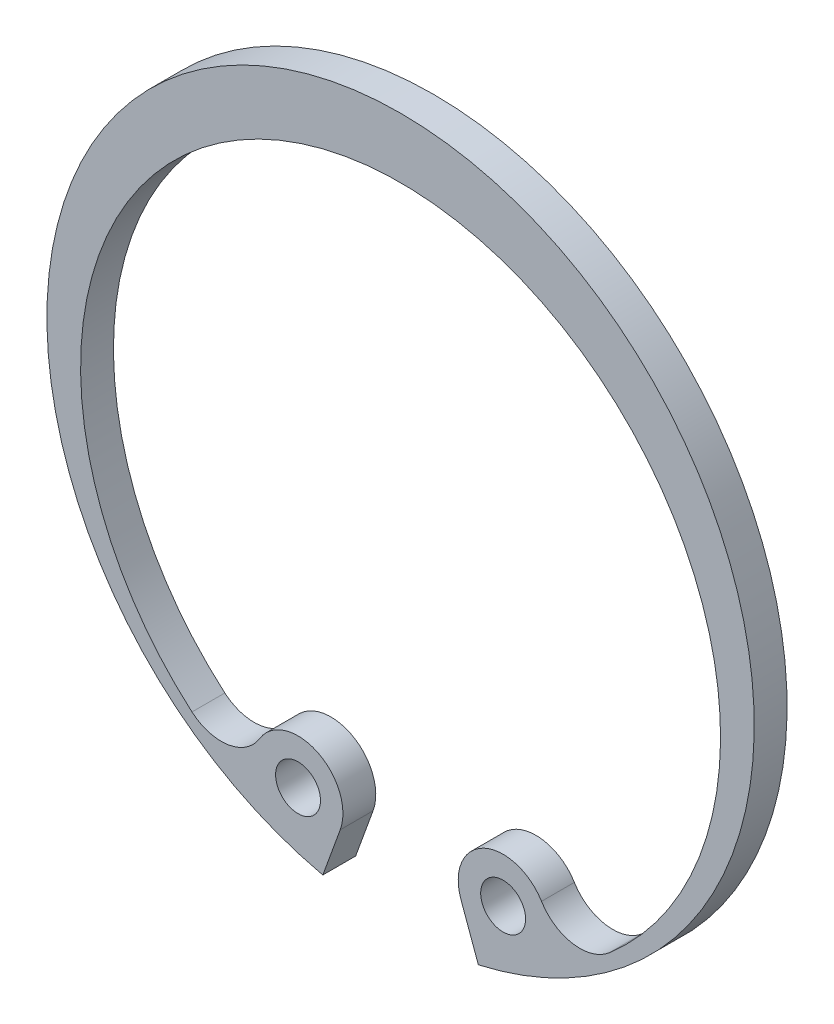
ISO-10303-21;
HEADER;
FILE_DESCRIPTION(('STEP AP214'),'2;1');
FILE_NAME('part.step','',(''),(''),'','','');
FILE_SCHEMA(('AUTOMOTIVE_DESIGN { 1 0 10303 214 1 1 1 1 }'));
ENDSEC;
DATA;
#1=APPLICATION_CONTEXT('core data for automotive mechanical design processes');
#2=APPLICATION_PROTOCOL_DEFINITION('international standard','automotive_design',2000,#1);
#3=PRODUCT_CONTEXT('',#1,'mechanical');
#4=PRODUCT('Part','Part','',(#3));
#5=PRODUCT_RELATED_PRODUCT_CATEGORY('part','',(#4));
#6=PRODUCT_DEFINITION_FORMATION('','',#4);
#7=PRODUCT_DEFINITION_CONTEXT('part definition',#1,'design');
#8=PRODUCT_DEFINITION('design','',#6,#7);
#9=PRODUCT_DEFINITION_SHAPE('','',#8);
#10=(LENGTH_UNIT() NAMED_UNIT(*) SI_UNIT(.MILLI.,.METRE.));
#11=(NAMED_UNIT(*) PLANE_ANGLE_UNIT() SI_UNIT($,.RADIAN.));
#12=(NAMED_UNIT(*) SI_UNIT($,.STERADIAN.) SOLID_ANGLE_UNIT());
#13=UNCERTAINTY_MEASURE_WITH_UNIT(LENGTH_MEASURE(1.E-05),#10,'distance_accuracy_value','');
#14=(GEOMETRIC_REPRESENTATION_CONTEXT(3) GLOBAL_UNCERTAINTY_ASSIGNED_CONTEXT((#13)) GLOBAL_UNIT_ASSIGNED_CONTEXT((#10,
#11,#12)) REPRESENTATION_CONTEXT('',''));
#15=CARTESIAN_POINT('',(0.,0.,0.));
#16=DIRECTION('',(0.,0.,1.));
#17=DIRECTION('',(1.,0.,0.));
#18=AXIS2_PLACEMENT_3D('',#15,#16,#17);
#19=CARTESIAN_POINT('',(0.,-0.7874,1.95));
#20=DIRECTION('',(0.,0.,-1.));
#21=DIRECTION('',(-1.,0.,0.));
#22=AXIS2_PLACEMENT_3D('',#19,#20,#21);
#23=CYLINDRICAL_SURFACE('',#22,9.5);
#24=CARTESIAN_POINT('',(0.,-0.7874,0.975));
#25=DIRECTION('',(0.,0.,1.));
#26=DIRECTION('',(1.,0.,0.));
#27=AXIS2_PLACEMENT_3D('',#24,#25,#26);
#28=CIRCLE('',#27,9.5);
#29=CARTESIAN_POINT('',(6.19276009205528,-7.99154619800622,0.975));
#30=VERTEX_POINT('',#29);
#31=CARTESIAN_POINT('',(-6.19276009205528,-7.99154619800622,0.975));
#32=VERTEX_POINT('',#31);
#33=EDGE_CURVE('E132',#30,#32,#28,.T.);
#34=ORIENTED_EDGE('',*,*,#33,.F.);
#35=DIRECTION('',(0.,0.,-1.));
#36=VECTOR('',#35,1.);
#37=CARTESIAN_POINT('',(6.19276009205528,-7.99154619800622,1.95));
#38=LINE('',#37,#36);
#39=CARTESIAN_POINT('',(6.19276009205528,-7.99154619800622,1.95));
#40=VERTEX_POINT('',#39);
#41=EDGE_CURVE('E11',#40,#30,#38,.T.);
#42=ORIENTED_EDGE('',*,*,#41,.F.);
#43=CARTESIAN_POINT('',(0.,-0.7874,1.95));
#44=DIRECTION('',(0.,0.,1.));
#45=DIRECTION('',(1.,0.,0.));
#46=AXIS2_PLACEMENT_3D('',#43,#44,#45);
#47=CIRCLE('',#46,9.5);
#48=CARTESIAN_POINT('',(-6.19276009205528,-7.99154619800622,1.95));
#49=VERTEX_POINT('',#48);
#50=EDGE_CURVE('E153',#40,#49,#47,.T.);
#51=ORIENTED_EDGE('',*,*,#50,.T.);
#52=DIRECTION('',(0.,0.,-1.));
#53=VECTOR('',#52,1.);
#54=CARTESIAN_POINT('',(-6.19276009205528,-7.99154619800622,1.95));
#55=LINE('',#54,#53);
#56=EDGE_CURVE('E38',#49,#32,#55,.T.);
#57=ORIENTED_EDGE('',*,*,#56,.T.);
#58=EDGE_LOOP('',(#34,#42,#51,#57));
#59=FACE_BOUND('',#58,.T.);
#60=ADVANCED_FACE('F35',(#59),#23,.F.);
#61=CARTESIAN_POINT('',(5.32360078088962,-6.98043795968956,1.95));
#62=DIRECTION('',(0.,0.,-1.));
#63=DIRECTION('',(-1.,0.,0.));
#64=AXIS2_PLACEMENT_3D('',#61,#62,#63);
#65=CYLINDRICAL_SURFACE('',#64,1.33333333333333);
#66=CARTESIAN_POINT('',(5.32360078088962,-6.98043795968956,0.975));
#67=DIRECTION('',(0.,0.,1.));
#68=DIRECTION('',(1.,0.,0.));
#69=AXIS2_PLACEMENT_3D('',#66,#67,#68);
#70=CIRCLE('',#69,1.33333333333333);
#71=CARTESIAN_POINT('',(4.18415582842588,-7.67285617008172,0.975));
#72=VERTEX_POINT('',#71);
#73=EDGE_CURVE('E151',#72,#30,#70,.T.);
#74=ORIENTED_EDGE('',*,*,#73,.F.);
#75=DIRECTION('',(0.,0.,-1.));
#76=VECTOR('',#75,1.);
#77=CARTESIAN_POINT('',(4.18415582842588,-7.67285617008172,1.95));
#78=LINE('',#77,#76);
#79=CARTESIAN_POINT('',(4.18415582842588,-7.67285617008172,1.95));
#80=VERTEX_POINT('',#79);
#81=EDGE_CURVE('E44',#80,#72,#78,.T.);
#82=ORIENTED_EDGE('',*,*,#81,.F.);
#83=CARTESIAN_POINT('',(5.32360078088962,-6.98043795968956,1.95));
#84=DIRECTION('',(0.,0.,1.));
#85=DIRECTION('',(1.,0.,0.));
#86=AXIS2_PLACEMENT_3D('',#83,#84,#85);
#87=CIRCLE('',#86,1.33333333333333);
#88=EDGE_CURVE('E122',#80,#40,#87,.T.);
#89=ORIENTED_EDGE('',*,*,#88,.T.);
#90=ORIENTED_EDGE('',*,*,#41,.T.);
#91=EDGE_LOOP('',(#74,#82,#89,#90));
#92=FACE_BOUND('',#91,.T.);
#93=ADVANCED_FACE('F165',(#92),#65,.F.);
#94=CARTESIAN_POINT('',(3.04471087596214,-8.36527438047387,1.95));
#95=DIRECTION('',(0.,0.,-1.));
#96=DIRECTION('',(-1.,0.,0.));
#97=AXIS2_PLACEMENT_3D('',#94,#95,#96);
#98=CYLINDRICAL_SURFACE('',#97,1.33333333333333);
#99=CARTESIAN_POINT('',(3.04471087596214,-8.36527438047387,0.975));
#100=DIRECTION('',(0.,0.,-1.));
#101=DIRECTION('',(-1.,0.,0.));
#102=AXIS2_PLACEMENT_3D('',#99,#100,#101);
#103=CIRCLE('',#102,1.33333333333333);
#104=CARTESIAN_POINT('',(1.79178738158093,-8.82130123824143,0.975));
#105=VERTEX_POINT('',#104);
#106=EDGE_CURVE('E109',#105,#72,#103,.T.);
#107=ORIENTED_EDGE('',*,*,#106,.F.);
#108=DIRECTION('',(0.,0.,-1.));
#109=VECTOR('',#108,1.);
#110=CARTESIAN_POINT('',(1.79178738158093,-8.82130123824143,1.95));
#111=LINE('',#110,#109);
#112=CARTESIAN_POINT('',(1.79178738158093,-8.82130123824143,1.95));
#113=VERTEX_POINT('',#112);
#114=EDGE_CURVE('E104',#113,#105,#111,.T.);
#115=ORIENTED_EDGE('',*,*,#114,.F.);
#116=CARTESIAN_POINT('',(3.04471087596214,-8.36527438047387,1.95));
#117=DIRECTION('',(0.,0.,-1.));
#118=DIRECTION('',(-1.,0.,0.));
#119=AXIS2_PLACEMENT_3D('',#116,#117,#118);
#120=CIRCLE('',#119,1.33333333333333);
#121=EDGE_CURVE('E107',#113,#80,#120,.T.);
#122=ORIENTED_EDGE('',*,*,#121,.T.);
#123=ORIENTED_EDGE('',*,*,#81,.T.);
#124=EDGE_LOOP('',(#107,#115,#122,#123));
#125=FACE_BOUND('',#124,.T.);
#126=ADVANCED_FACE('F106',(#125),#98,.T.);
#127=CARTESIAN_POINT('',(2.30921625274565,-10.2429253779404,1.95));
#128=DIRECTION('',(-0.939692620785908,-0.34202014332567,0.));
#129=DIRECTION('',(0.34202014332567,-0.939692620785908,0.));
#130=AXIS2_PLACEMENT_3D('',#127,#128,#129);
#131=PLANE('',#130);
#132=DIRECTION('',(-0.34202014332567,0.939692620785908,0.));
#133=VECTOR('',#132,1.);
#134=CARTESIAN_POINT('',(2.30921625274565,-10.2429253779404,0.975));
#135=LINE('',#134,#133);
#136=CARTESIAN_POINT('',(2.30921625274566,-10.2429253779404,0.975));
#137=VERTEX_POINT('',#136);
#138=EDGE_CURVE('E148',#137,#105,#135,.T.);
#139=ORIENTED_EDGE('',*,*,#138,.F.);
#140=DIRECTION('',(0.,0.,-1.));
#141=VECTOR('',#140,1.);
#142=CARTESIAN_POINT('',(2.30921625274566,-10.2429253779404,1.95));
#143=LINE('',#142,#141);
#144=CARTESIAN_POINT('',(2.30921625274566,-10.2429253779404,1.95));
#145=VERTEX_POINT('',#144);
#146=EDGE_CURVE('E114',#145,#137,#143,.T.);
#147=ORIENTED_EDGE('',*,*,#146,.F.);
#148=DIRECTION('',(-0.34202014332567,0.939692620785908,0.));
#149=VECTOR('',#148,1.);
#150=CARTESIAN_POINT('',(2.30921625274565,-10.2429253779404,1.95));
#151=LINE('',#150,#149);
#152=EDGE_CURVE('E120',#145,#113,#151,.T.);
#153=ORIENTED_EDGE('',*,*,#152,.T.);
#154=ORIENTED_EDGE('',*,*,#114,.T.);
#155=EDGE_LOOP('',(#139,#147,#153,#154));
#156=FACE_BOUND('',#155,.T.);
#157=ADVANCED_FACE('F124',(#156),#131,.T.);
#158=CARTESIAN_POINT('',(0.,0.,1.95));
#159=DIRECTION('',(0.,0.,-1.));
#160=DIRECTION('',(-1.,0.,0.));
#161=AXIS2_PLACEMENT_3D('',#158,#159,#160);
#162=CYLINDRICAL_SURFACE('',#161,10.5);
#163=CARTESIAN_POINT('',(0.,0.,0.975));
#164=DIRECTION('',(0.,0.,-1.));
#165=DIRECTION('',(-1.,0.,0.));
#166=AXIS2_PLACEMENT_3D('',#163,#164,#165);
#167=CIRCLE('',#166,10.5);
#168=CARTESIAN_POINT('',(-2.30921625274565,-10.2429253779404,0.975));
#169=VERTEX_POINT('',#168);
#170=EDGE_CURVE('E145',#169,#137,#167,.T.);
#171=ORIENTED_EDGE('',*,*,#170,.F.);
#172=DIRECTION('',(0.,0.,-1.));
#173=VECTOR('',#172,1.);
#174=CARTESIAN_POINT('',(-2.30921625274565,-10.2429253779404,1.95));
#175=LINE('',#174,#173);
#176=CARTESIAN_POINT('',(-2.30921625274565,-10.2429253779404,1.95));
#177=VERTEX_POINT('',#176);
#178=EDGE_CURVE('E157',#177,#169,#175,.T.);
#179=ORIENTED_EDGE('',*,*,#178,.F.);
#180=CARTESIAN_POINT('',(0.,0.,1.95));
#181=DIRECTION('',(0.,0.,-1.));
#182=DIRECTION('',(-1.,0.,0.));
#183=AXIS2_PLACEMENT_3D('',#180,#181,#182);
#184=CIRCLE('',#183,10.5);
#185=EDGE_CURVE('E125',#177,#145,#184,.T.);
#186=ORIENTED_EDGE('',*,*,#185,.T.);
#187=ORIENTED_EDGE('',*,*,#146,.T.);
#188=EDGE_LOOP('',(#171,#179,#186,#187));
#189=FACE_BOUND('',#188,.T.);
#190=ADVANCED_FACE('F178',(#189),#162,.T.);
#191=CARTESIAN_POINT('',(-1.79178738158093,-8.82130123824143,1.95));
#192=DIRECTION('',(0.939692620785908,-0.34202014332567,0.));
#193=DIRECTION('',(0.34202014332567,0.939692620785908,0.));
#194=AXIS2_PLACEMENT_3D('',#191,#192,#193);
#195=PLANE('',#194);
#196=DIRECTION('',(-0.34202014332567,-0.939692620785908,0.));
#197=VECTOR('',#196,1.);
#198=CARTESIAN_POINT('',(-1.79178738158093,-8.82130123824143,0.975));
#199=LINE('',#198,#197);
#200=CARTESIAN_POINT('',(-1.79178738158093,-8.82130123824143,0.975));
#201=VERTEX_POINT('',#200);
#202=EDGE_CURVE('E142',#201,#169,#199,.T.);
#203=ORIENTED_EDGE('',*,*,#202,.F.);
#204=DIRECTION('',(0.,0.,-1.));
#205=VECTOR('',#204,1.);
#206=CARTESIAN_POINT('',(-1.79178738158093,-8.82130123824143,1.95));
#207=LINE('',#206,#205);
#208=CARTESIAN_POINT('',(-1.79178738158093,-8.82130123824143,1.95));
#209=VERTEX_POINT('',#208);
#210=EDGE_CURVE('E159',#209,#201,#207,.T.);
#211=ORIENTED_EDGE('',*,*,#210,.F.);
#212=DIRECTION('',(-0.34202014332567,-0.939692620785908,0.));
#213=VECTOR('',#212,1.);
#214=CARTESIAN_POINT('',(-1.79178738158093,-8.82130123824143,1.95));
#215=LINE('',#214,#213);
#216=EDGE_CURVE('E127',#209,#177,#215,.T.);
#217=ORIENTED_EDGE('',*,*,#216,.T.);
#218=ORIENTED_EDGE('',*,*,#178,.T.);
#219=EDGE_LOOP('',(#203,#211,#217,#218));
#220=FACE_BOUND('',#219,.T.);
#221=ADVANCED_FACE('F181',(#220),#195,.T.);
#222=CARTESIAN_POINT('',(-3.04471087596214,-8.36527438047387,1.95));
#223=DIRECTION('',(0.,0.,-1.));
#224=DIRECTION('',(-1.,0.,0.));
#225=AXIS2_PLACEMENT_3D('',#222,#223,#224);
#226=CYLINDRICAL_SURFACE('',#225,1.33333333333333);
#227=CARTESIAN_POINT('',(-3.04471087596214,-8.36527438047387,0.975));
#228=DIRECTION('',(0.,0.,-1.));
#229=DIRECTION('',(-1.,0.,0.));
#230=AXIS2_PLACEMENT_3D('',#227,#228,#229);
#231=CIRCLE('',#230,1.33333333333333);
#232=CARTESIAN_POINT('',(-4.18415582842588,-7.67285617008172,0.975));
#233=VERTEX_POINT('',#232);
#234=EDGE_CURVE('E139',#233,#201,#231,.T.);
#235=ORIENTED_EDGE('',*,*,#234,.F.);
#236=DIRECTION('',(0.,0.,-1.));
#237=VECTOR('',#236,1.);
#238=CARTESIAN_POINT('',(-4.18415582842588,-7.67285617008172,1.95));
#239=LINE('',#238,#237);
#240=CARTESIAN_POINT('',(-4.18415582842588,-7.67285617008172,1.95));
#241=VERTEX_POINT('',#240);
#242=EDGE_CURVE('E160',#241,#233,#239,.T.);
#243=ORIENTED_EDGE('',*,*,#242,.F.);
#244=CARTESIAN_POINT('',(-3.04471087596214,-8.36527438047387,1.95));
#245=DIRECTION('',(0.,0.,-1.));
#246=DIRECTION('',(-1.,0.,0.));
#247=AXIS2_PLACEMENT_3D('',#244,#245,#246);
#248=CIRCLE('',#247,1.33333333333333);
#249=EDGE_CURVE('E227',#241,#209,#248,.T.);
#250=ORIENTED_EDGE('',*,*,#249,.T.);
#251=ORIENTED_EDGE('',*,*,#210,.T.);
#252=EDGE_LOOP('',(#235,#243,#250,#251));
#253=FACE_BOUND('',#252,.T.);
#254=ADVANCED_FACE('F185',(#253),#226,.T.);
#255=CARTESIAN_POINT('',(-5.32360078088962,-6.98043795968956,1.95));
#256=DIRECTION('',(0.,0.,-1.));
#257=DIRECTION('',(-1.,0.,0.));
#258=AXIS2_PLACEMENT_3D('',#255,#256,#257);
#259=CYLINDRICAL_SURFACE('',#258,1.33333333333333);
#260=CARTESIAN_POINT('',(-5.32360078088962,-6.98043795968956,0.975));
#261=DIRECTION('',(0.,0.,1.));
#262=DIRECTION('',(1.,0.,0.));
#263=AXIS2_PLACEMENT_3D('',#260,#261,#262);
#264=CIRCLE('',#263,1.33333333333333);
#265=EDGE_CURVE('E135',#32,#233,#264,.T.);
#266=ORIENTED_EDGE('',*,*,#265,.F.);
#267=ORIENTED_EDGE('',*,*,#56,.F.);
#268=CARTESIAN_POINT('',(-5.32360078088962,-6.98043795968956,1.95));
#269=DIRECTION('',(0.,0.,1.));
#270=DIRECTION('',(1.,0.,0.));
#271=AXIS2_PLACEMENT_3D('',#268,#269,#270);
#272=CIRCLE('',#271,1.33333333333333);
#273=EDGE_CURVE('E225',#49,#241,#272,.T.);
#274=ORIENTED_EDGE('',*,*,#273,.T.);
#275=ORIENTED_EDGE('',*,*,#242,.T.);
#276=EDGE_LOOP('',(#266,#267,#274,#275));
#277=FACE_BOUND('',#276,.T.);
#278=ADVANCED_FACE('F162',(#277),#259,.F.);
#279=CARTESIAN_POINT('',(0.,-0.7874,1.95));
#280=DIRECTION('',(0.,0.,1.));
#281=DIRECTION('',(1.,0.,0.));
#282=AXIS2_PLACEMENT_3D('',#279,#280,#281);
#283=PLANE('',#282);
#284=CARTESIAN_POINT('',(-3.04471087596214,-8.36527438047387,1.95));
#285=DIRECTION('',(0.,0.,-1.));
#286=DIRECTION('',(1.,0.,0.));
#287=AXIS2_PLACEMENT_3D('',#284,#285,#286);
#288=CIRCLE('',#287,0.666666666666667);
#289=CARTESIAN_POINT('',(-2.37804420929547,-8.36527438047387,1.95));
#290=VERTEX_POINT('',#289);
#291=EDGE_CURVE('E212',#290,#290,#288,.T.);
#292=ORIENTED_EDGE('',*,*,#291,.T.);
#293=EDGE_LOOP('',(#292));
#294=FACE_BOUND('',#293,.T.);
#295=CARTESIAN_POINT('',(3.04471087596214,-8.36527438047387,1.95));
#296=DIRECTION('',(0.,0.,-1.));
#297=DIRECTION('',(1.,0.,0.));
#298=AXIS2_PLACEMENT_3D('',#295,#296,#297);
#299=CIRCLE('',#298,0.666666666666667);
#300=CARTESIAN_POINT('',(3.71137754262881,-8.36527438047387,1.95));
#301=VERTEX_POINT('',#300);
#302=EDGE_CURVE('E136',#301,#301,#299,.T.);
#303=ORIENTED_EDGE('',*,*,#302,.T.);
#304=EDGE_LOOP('',(#303));
#305=FACE_BOUND('',#304,.T.);
#306=ORIENTED_EDGE('',*,*,#50,.F.);
#307=ORIENTED_EDGE('',*,*,#88,.F.);
#308=ORIENTED_EDGE('',*,*,#121,.F.);
#309=ORIENTED_EDGE('',*,*,#152,.F.);
#310=ORIENTED_EDGE('',*,*,#185,.F.);
#311=ORIENTED_EDGE('',*,*,#216,.F.);
#312=ORIENTED_EDGE('',*,*,#249,.F.);
#313=ORIENTED_EDGE('',*,*,#273,.F.);
#314=EDGE_LOOP('',(#306,#307,#308,#309,#310,#311,#312,#313));
#315=FACE_BOUND('',#314,.T.);
#316=ADVANCED_FACE('F118',(#294,#305,#315),#283,.T.);
#317=CARTESIAN_POINT('',(0.,-0.7874,0.975));
#318=DIRECTION('',(0.,0.,1.));
#319=DIRECTION('',(1.,0.,0.));
#320=AXIS2_PLACEMENT_3D('',#317,#318,#319);
#321=PLANE('',#320);
#322=CARTESIAN_POINT('',(-3.04471087596214,-8.36527438047387,0.975));
#323=DIRECTION('',(0.,0.,-1.));
#324=DIRECTION('',(1.,0.,0.));
#325=AXIS2_PLACEMENT_3D('',#322,#323,#324);
#326=CIRCLE('',#325,0.666666666666667);
#327=CARTESIAN_POINT('',(-2.37804420929547,-8.36527438047387,0.975));
#328=VERTEX_POINT('',#327);
#329=EDGE_CURVE('E215',#328,#328,#326,.T.);
#330=ORIENTED_EDGE('',*,*,#329,.F.);
#331=EDGE_LOOP('',(#330));
#332=FACE_BOUND('',#331,.T.);
#333=CARTESIAN_POINT('',(3.04471087596214,-8.36527438047387,0.975));
#334=DIRECTION('',(0.,0.,-1.));
#335=DIRECTION('',(1.,0.,0.));
#336=AXIS2_PLACEMENT_3D('',#333,#334,#335);
#337=CIRCLE('',#336,0.666666666666667);
#338=CARTESIAN_POINT('',(3.71137754262881,-8.36527438047387,0.975));
#339=VERTEX_POINT('',#338);
#340=EDGE_CURVE('E217',#339,#339,#337,.T.);
#341=ORIENTED_EDGE('',*,*,#340,.F.);
#342=EDGE_LOOP('',(#341));
#343=FACE_BOUND('',#342,.T.);
#344=ORIENTED_EDGE('',*,*,#33,.T.);
#345=ORIENTED_EDGE('',*,*,#265,.T.);
#346=ORIENTED_EDGE('',*,*,#234,.T.);
#347=ORIENTED_EDGE('',*,*,#202,.T.);
#348=ORIENTED_EDGE('',*,*,#170,.T.);
#349=ORIENTED_EDGE('',*,*,#138,.T.);
#350=ORIENTED_EDGE('',*,*,#106,.T.);
#351=ORIENTED_EDGE('',*,*,#73,.T.);
#352=EDGE_LOOP('',(#344,#345,#346,#347,#348,#349,#350,#351));
#353=FACE_BOUND('',#352,.T.);
#354=ADVANCED_FACE('F164',(#332,#343,#353),#321,.F.);
#355=CARTESIAN_POINT('',(3.04471087596214,-8.36527438047387,1.95));
#356=DIRECTION('',(0.,0.,-1.));
#357=DIRECTION('',(-1.,0.,0.));
#358=AXIS2_PLACEMENT_3D('',#355,#356,#357);
#359=CYLINDRICAL_SURFACE('',#358,0.666666666666667);
#360=ORIENTED_EDGE('',*,*,#302,.F.);
#361=EDGE_LOOP('',(#360));
#362=FACE_BOUND('',#361,.T.);
#363=ORIENTED_EDGE('',*,*,#340,.T.);
#364=EDGE_LOOP('',(#363));
#365=FACE_BOUND('',#364,.T.);
#366=ADVANCED_FACE('F197',(#362,#365),#359,.F.);
#367=CARTESIAN_POINT('',(-3.04471087596214,-8.36527438047387,1.95));
#368=DIRECTION('',(0.,0.,-1.));
#369=DIRECTION('',(-1.,0.,0.));
#370=AXIS2_PLACEMENT_3D('',#367,#368,#369);
#371=CYLINDRICAL_SURFACE('',#370,0.666666666666667);
#372=ORIENTED_EDGE('',*,*,#291,.F.);
#373=EDGE_LOOP('',(#372));
#374=FACE_BOUND('',#373,.T.);
#375=ORIENTED_EDGE('',*,*,#329,.T.);
#376=EDGE_LOOP('',(#375));
#377=FACE_BOUND('',#376,.T.);
#378=ADVANCED_FACE('F204',(#374,#377),#371,.F.);
#379=CLOSED_SHELL('',(#60,#93,#126,#157,#190,#221,#254,#278,#316,#354,#366,#378));
#380=MANIFOLD_SOLID_BREP('B2',#379);
#381=ADVANCED_BREP_SHAPE_REPRESENTATION('',(#18,#380),#14);
#382=SHAPE_DEFINITION_REPRESENTATION(#9,#381);
ENDSEC;
END-ISO-10303-21;
